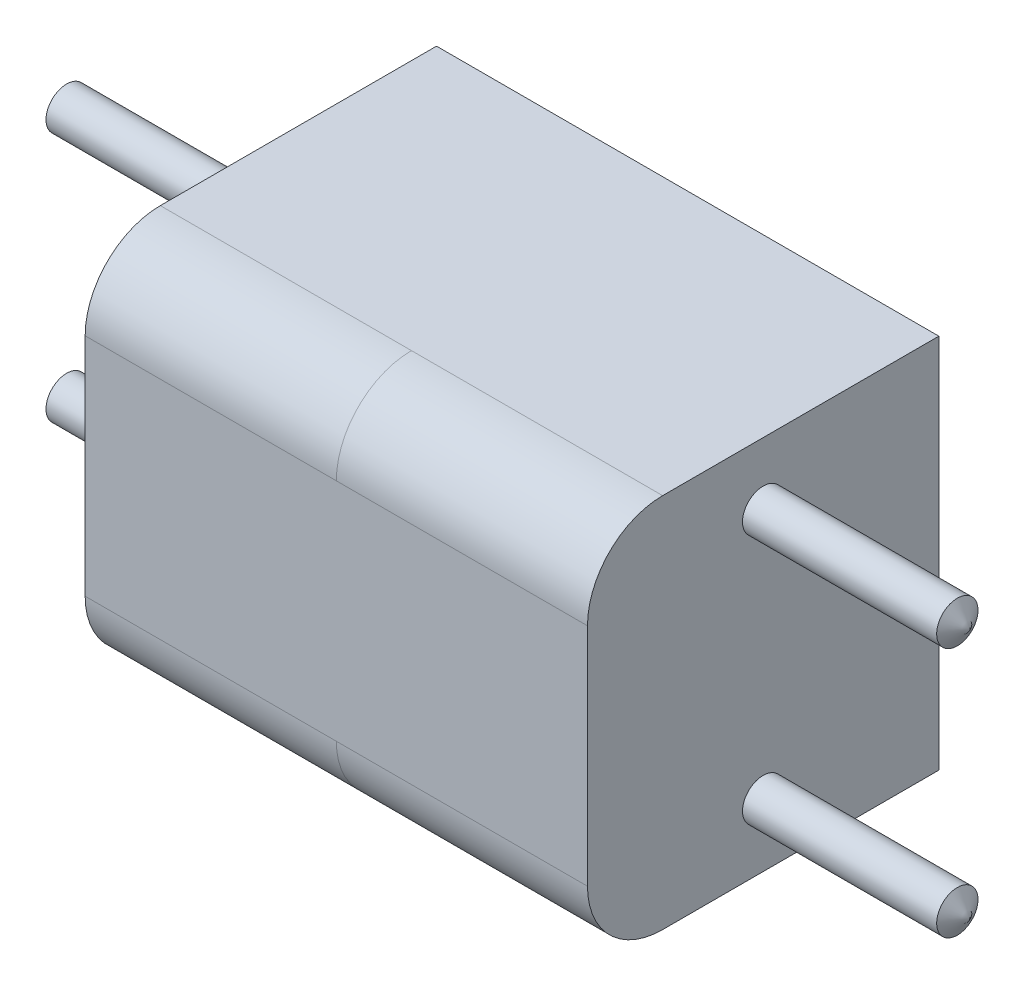
ISO-10303-21;
HEADER;
FILE_DESCRIPTION(('STEP AP214'),'2;1');
FILE_NAME('part.step','',(''),(''),'','','');
FILE_SCHEMA(('AUTOMOTIVE_DESIGN { 1 0 10303 214 1 1 1 1 }'));
ENDSEC;
DATA;
#1=APPLICATION_CONTEXT('core data for automotive mechanical design processes');
#2=APPLICATION_PROTOCOL_DEFINITION('international standard','automotive_design',2000,#1);
#3=PRODUCT_CONTEXT('',#1,'mechanical');
#4=PRODUCT('Part','Part','',(#3));
#5=PRODUCT_RELATED_PRODUCT_CATEGORY('part','',(#4));
#6=PRODUCT_DEFINITION_FORMATION('','',#4);
#7=PRODUCT_DEFINITION_CONTEXT('part definition',#1,'design');
#8=PRODUCT_DEFINITION('design','',#6,#7);
#9=PRODUCT_DEFINITION_SHAPE('','',#8);
#10=(LENGTH_UNIT() NAMED_UNIT(*) SI_UNIT(.MILLI.,.METRE.));
#11=(NAMED_UNIT(*) PLANE_ANGLE_UNIT() SI_UNIT($,.RADIAN.));
#12=(NAMED_UNIT(*) SI_UNIT($,.STERADIAN.) SOLID_ANGLE_UNIT());
#13=UNCERTAINTY_MEASURE_WITH_UNIT(LENGTH_MEASURE(1.E-05),#10,'distance_accuracy_value','');
#14=(GEOMETRIC_REPRESENTATION_CONTEXT(3) GLOBAL_UNCERTAINTY_ASSIGNED_CONTEXT((#13)) GLOBAL_UNIT_ASSIGNED_CONTEXT((#10,
#11,#12)) REPRESENTATION_CONTEXT('',''));
#15=CARTESIAN_POINT('',(0.,0.,0.));
#16=DIRECTION('',(0.,0.,1.));
#17=DIRECTION('',(1.,0.,0.));
#18=AXIS2_PLACEMENT_3D('',#15,#16,#17);
#19=CARTESIAN_POINT('',(20.05,15.00225,0.));
#20=DIRECTION('',(0.,0.,1.));
#21=DIRECTION('',(1.,0.,0.));
#22=AXIS2_PLACEMENT_3D('',#19,#20,#21);
#23=PLANE('',#22);
#24=DIRECTION('',(-1.,0.,0.));
#25=VECTOR('',#24,1.);
#26=CARTESIAN_POINT('',(20.05,-15.00225,0.));
#27=LINE('',#26,#25);
#28=CARTESIAN_POINT('',(20.05,-15.00225,0.));
#29=VERTEX_POINT('',#28);
#30=CARTESIAN_POINT('',(-20.05,-15.00225,0.));
#31=VERTEX_POINT('',#30);
#32=EDGE_CURVE('E196',#29,#31,#27,.T.);
#33=ORIENTED_EDGE('',*,*,#32,.T.);
#34=DIRECTION('',(0.,1.,0.));
#35=VECTOR('',#34,1.);
#36=CARTESIAN_POINT('',(-20.05,15.00225,0.));
#37=LINE('',#36,#35);
#38=CARTESIAN_POINT('',(-20.05,15.00225,0.));
#39=VERTEX_POINT('',#38);
#40=EDGE_CURVE('E221',#31,#39,#37,.T.);
#41=ORIENTED_EDGE('',*,*,#40,.T.);
#42=DIRECTION('',(-1.,0.,0.));
#43=VECTOR('',#42,1.);
#44=CARTESIAN_POINT('',(20.05,15.00225,0.));
#45=LINE('',#44,#43);
#46=CARTESIAN_POINT('',(20.05,15.00225,0.));
#47=VERTEX_POINT('',#46);
#48=EDGE_CURVE('E194',#47,#39,#45,.T.);
#49=ORIENTED_EDGE('',*,*,#48,.F.);
#50=DIRECTION('',(0.,1.,0.));
#51=VECTOR('',#50,1.);
#52=CARTESIAN_POINT('',(20.05,15.00225,0.));
#53=LINE('',#52,#51);
#54=EDGE_CURVE('E206',#29,#47,#53,.T.);
#55=ORIENTED_EDGE('',*,*,#54,.F.);
#56=EDGE_LOOP('',(#33,#41,#49,#55));
#57=FACE_BOUND('',#56,.T.);
#58=ADVANCED_FACE('F35',(#57),#23,.F.);
#59=CARTESIAN_POINT('',(20.05,15.00225,0.));
#60=DIRECTION('',(0.,-1.,0.));
#61=DIRECTION('',(0.,0.,-1.));
#62=AXIS2_PLACEMENT_3D('',#59,#60,#61);
#63=PLANE('',#62);
#64=DIRECTION('',(0.,0.,1.));
#65=VECTOR('',#64,1.);
#66=CARTESIAN_POINT('',(-20.05,15.00225,0.));
#67=LINE('',#66,#65);
#68=CARTESIAN_POINT('',(-20.05,15.00225,22.05));
#69=VERTEX_POINT('',#68);
#70=EDGE_CURVE('E215',#39,#69,#67,.T.);
#71=ORIENTED_EDGE('',*,*,#70,.T.);
#72=DIRECTION('',(1.,0.,0.));
#73=VECTOR('',#72,1.);
#74=CARTESIAN_POINT('',(20.05,15.00225,22.05));
#75=LINE('',#74,#73);
#76=CARTESIAN_POINT('',(0.,15.00225,22.05));
#77=VERTEX_POINT('',#76);
#78=EDGE_CURVE('E11',#69,#77,#75,.T.);
#79=ORIENTED_EDGE('',*,*,#78,.T.);
#80=DIRECTION('',(-1.,0.,0.));
#81=VECTOR('',#80,1.);
#82=CARTESIAN_POINT('',(20.05,15.00225,22.05));
#83=LINE('',#82,#81);
#84=CARTESIAN_POINT('',(20.05,15.00225,22.05));
#85=VERTEX_POINT('',#84);
#86=EDGE_CURVE('E177',#77,#85,#83,.F.);
#87=ORIENTED_EDGE('',*,*,#86,.T.);
#88=DIRECTION('',(0.,0.,1.));
#89=VECTOR('',#88,1.);
#90=CARTESIAN_POINT('',(20.05,15.00225,0.));
#91=LINE('',#90,#89);
#92=EDGE_CURVE('E203',#47,#85,#91,.T.);
#93=ORIENTED_EDGE('',*,*,#92,.F.);
#94=ORIENTED_EDGE('',*,*,#48,.T.);
#95=EDGE_LOOP('',(#71,#79,#87,#93,#94));
#96=FACE_BOUND('',#95,.T.);
#97=ADVANCED_FACE('F126',(#96),#63,.F.);
#98=CARTESIAN_POINT('',(20.05,15.00225,28.05));
#99=DIRECTION('',(0.,0.,-1.));
#100=DIRECTION('',(-1.,0.,0.));
#101=AXIS2_PLACEMENT_3D('',#98,#99,#100);
#102=PLANE('',#101);
#103=DIRECTION('',(0.,-1.,0.));
#104=VECTOR('',#103,1.);
#105=CARTESIAN_POINT('',(-20.05,15.00225,28.05));
#106=LINE('',#105,#104);
#107=CARTESIAN_POINT('',(-20.05,9.00224999999999,28.05));
#108=VERTEX_POINT('',#107);
#109=CARTESIAN_POINT('',(-20.05,-9.00225000000001,28.05));
#110=VERTEX_POINT('',#109);
#111=EDGE_CURVE('E217',#108,#110,#106,.T.);
#112=ORIENTED_EDGE('',*,*,#111,.T.);
#113=DIRECTION('',(1.,0.,0.));
#114=VECTOR('',#113,1.);
#115=CARTESIAN_POINT('',(20.05,-9.00225000000001,28.05));
#116=LINE('',#115,#114);
#117=CARTESIAN_POINT('',(0.,-9.00225000000001,28.05));
#118=VERTEX_POINT('',#117);
#119=EDGE_CURVE('E163',#110,#118,#116,.T.);
#120=ORIENTED_EDGE('',*,*,#119,.T.);
#121=DIRECTION('',(-1.,0.,0.));
#122=VECTOR('',#121,1.);
#123=CARTESIAN_POINT('',(20.05,-9.00225000000001,28.05));
#124=LINE('',#123,#122);
#125=CARTESIAN_POINT('',(20.05,-9.00225000000001,28.05));
#126=VERTEX_POINT('',#125);
#127=EDGE_CURVE('E183',#118,#126,#124,.F.);
#128=ORIENTED_EDGE('',*,*,#127,.T.);
#129=DIRECTION('',(0.,-1.,0.));
#130=VECTOR('',#129,1.);
#131=CARTESIAN_POINT('',(20.05,15.00225,28.05));
#132=LINE('',#131,#130);
#133=CARTESIAN_POINT('',(20.05,9.00224999999999,28.05));
#134=VERTEX_POINT('',#133);
#135=EDGE_CURVE('E200',#134,#126,#132,.T.);
#136=ORIENTED_EDGE('',*,*,#135,.F.);
#137=DIRECTION('',(-1.,0.,0.));
#138=VECTOR('',#137,1.);
#139=CARTESIAN_POINT('',(20.05,9.00224999999999,28.05));
#140=LINE('',#139,#138);
#141=CARTESIAN_POINT('',(0.,9.00224999999999,28.05));
#142=VERTEX_POINT('',#141);
#143=EDGE_CURVE('E185',#134,#142,#140,.T.);
#144=ORIENTED_EDGE('',*,*,#143,.T.);
#145=DIRECTION('',(1.,0.,0.));
#146=VECTOR('',#145,1.);
#147=CARTESIAN_POINT('',(20.05,9.00224999999999,28.05));
#148=LINE('',#147,#146);
#149=EDGE_CURVE('E169',#142,#108,#148,.F.);
#150=ORIENTED_EDGE('',*,*,#149,.T.);
#151=EDGE_LOOP('',(#112,#120,#128,#136,#144,#150));
#152=FACE_BOUND('',#151,.T.);
#153=ADVANCED_FACE('F132',(#152),#102,.F.);
#154=CARTESIAN_POINT('',(20.05,-15.00225,0.));
#155=DIRECTION('',(0.,1.,0.));
#156=DIRECTION('',(0.,0.,1.));
#157=AXIS2_PLACEMENT_3D('',#154,#155,#156);
#158=PLANE('',#157);
#159=DIRECTION('',(-1.,0.,0.));
#160=VECTOR('',#159,1.);
#161=CARTESIAN_POINT('',(20.05,-15.00225,22.05));
#162=LINE('',#161,#160);
#163=CARTESIAN_POINT('',(20.05,-15.00225,22.05));
#164=VERTEX_POINT('',#163);
#165=CARTESIAN_POINT('',(0.,-15.00225,22.05));
#166=VERTEX_POINT('',#165);
#167=EDGE_CURVE('E192',#164,#166,#162,.T.);
#168=ORIENTED_EDGE('',*,*,#167,.T.);
#169=DIRECTION('',(1.,0.,0.));
#170=VECTOR('',#169,1.);
#171=CARTESIAN_POINT('',(20.05,-15.00225,22.05));
#172=LINE('',#171,#170);
#173=CARTESIAN_POINT('',(-20.05,-15.00225,22.05));
#174=VERTEX_POINT('',#173);
#175=EDGE_CURVE('E58',#166,#174,#172,.F.);
#176=ORIENTED_EDGE('',*,*,#175,.T.);
#177=DIRECTION('',(0.,0.,-1.));
#178=VECTOR('',#177,1.);
#179=CARTESIAN_POINT('',(-20.05,-15.00225,0.));
#180=LINE('',#179,#178);
#181=EDGE_CURVE('E219',#174,#31,#180,.T.);
#182=ORIENTED_EDGE('',*,*,#181,.T.);
#183=ORIENTED_EDGE('',*,*,#32,.F.);
#184=DIRECTION('',(0.,0.,-1.));
#185=VECTOR('',#184,1.);
#186=CARTESIAN_POINT('',(20.05,-15.00225,0.));
#187=LINE('',#186,#185);
#188=EDGE_CURVE('E198',#164,#29,#187,.T.);
#189=ORIENTED_EDGE('',*,*,#188,.F.);
#190=EDGE_LOOP('',(#168,#176,#182,#183,#189));
#191=FACE_BOUND('',#190,.T.);
#192=ADVANCED_FACE('F244',(#191),#158,.F.);
#193=CARTESIAN_POINT('',(20.05,0.,0.));
#194=DIRECTION('',(-1.,0.,0.));
#195=DIRECTION('',(0.,0.,1.));
#196=AXIS2_PLACEMENT_3D('',#193,#194,#195);
#197=PLANE('',#196);
#198=CARTESIAN_POINT('',(20.05,-10.,14.025));
#199=DIRECTION('',(-1.,0.,0.));
#200=DIRECTION('',(0.,0.,1.));
#201=AXIS2_PLACEMENT_3D('',#198,#199,#200);
#202=CIRCLE('',#201,1.65);
#203=CARTESIAN_POINT('',(20.05,-10.,15.675));
#204=VERTEX_POINT('',#203);
#205=EDGE_CURVE('E171',#204,#204,#202,.F.);
#206=ORIENTED_EDGE('',*,*,#205,.F.);
#207=EDGE_LOOP('',(#206));
#208=FACE_BOUND('',#207,.T.);
#209=CARTESIAN_POINT('',(20.05,9.99999999999999,14.025));
#210=DIRECTION('',(-1.,0.,0.));
#211=DIRECTION('',(0.,0.,1.));
#212=AXIS2_PLACEMENT_3D('',#209,#210,#211);
#213=CIRCLE('',#212,1.65);
#214=CARTESIAN_POINT('',(20.05,9.99999999999999,15.675));
#215=VERTEX_POINT('',#214);
#216=EDGE_CURVE('E174',#215,#215,#213,.F.);
#217=ORIENTED_EDGE('',*,*,#216,.F.);
#218=EDGE_LOOP('',(#217));
#219=FACE_BOUND('',#218,.T.);
#220=ORIENTED_EDGE('',*,*,#135,.T.);
#221=CARTESIAN_POINT('',(20.05,-9.00225000000001,22.05));
#222=DIRECTION('',(-1.,0.,0.));
#223=DIRECTION('',(0.,0.,1.));
#224=AXIS2_PLACEMENT_3D('',#221,#222,#223);
#225=CIRCLE('',#224,6.);
#226=EDGE_CURVE('E179',#126,#164,#225,.F.);
#227=ORIENTED_EDGE('',*,*,#226,.T.);
#228=ORIENTED_EDGE('',*,*,#188,.T.);
#229=ORIENTED_EDGE('',*,*,#54,.T.);
#230=ORIENTED_EDGE('',*,*,#92,.T.);
#231=CARTESIAN_POINT('',(20.05,9.00224999999999,22.05));
#232=DIRECTION('',(-1.,0.,0.));
#233=DIRECTION('',(0.,0.,1.));
#234=AXIS2_PLACEMENT_3D('',#231,#232,#233);
#235=CIRCLE('',#234,6.);
#236=EDGE_CURVE('E181',#85,#134,#235,.F.);
#237=ORIENTED_EDGE('',*,*,#236,.T.);
#238=EDGE_LOOP('',(#220,#227,#228,#229,#230,#237));
#239=FACE_BOUND('',#238,.T.);
#240=ADVANCED_FACE('F142',(#208,#219,#239),#197,.F.);
#241=CARTESIAN_POINT('',(20.05,-9.00225000000001,22.05));
#242=DIRECTION('',(-1.,0.,0.));
#243=DIRECTION('',(0.,0.,1.));
#244=AXIS2_PLACEMENT_3D('',#241,#242,#243);
#245=CYLINDRICAL_SURFACE('',#244,6.);
#246=ORIENTED_EDGE('',*,*,#226,.F.);
#247=ORIENTED_EDGE('',*,*,#127,.F.);
#248=CARTESIAN_POINT('',(0.,-9.00225000000001,22.05));
#249=DIRECTION('',(-1.,0.,0.));
#250=DIRECTION('',(0.,0.,1.));
#251=AXIS2_PLACEMENT_3D('',#248,#249,#250);
#252=CIRCLE('',#251,6.);
#253=EDGE_CURVE('E188',#166,#118,#252,.T.);
#254=ORIENTED_EDGE('',*,*,#253,.F.);
#255=ORIENTED_EDGE('',*,*,#167,.F.);
#256=EDGE_LOOP('',(#246,#247,#254,#255));
#257=FACE_BOUND('',#256,.T.);
#258=ADVANCED_FACE('F138',(#257),#245,.T.);
#259=CARTESIAN_POINT('',(20.05,9.00224999999999,22.05));
#260=DIRECTION('',(-1.,0.,0.));
#261=DIRECTION('',(0.,0.,1.));
#262=AXIS2_PLACEMENT_3D('',#259,#260,#261);
#263=CYLINDRICAL_SURFACE('',#262,6.);
#264=ORIENTED_EDGE('',*,*,#236,.F.);
#265=ORIENTED_EDGE('',*,*,#86,.F.);
#266=CARTESIAN_POINT('',(0.,9.00224999999999,22.05));
#267=DIRECTION('',(-1.,0.,0.));
#268=DIRECTION('',(0.,0.,1.));
#269=AXIS2_PLACEMENT_3D('',#266,#267,#268);
#270=CIRCLE('',#269,6.);
#271=EDGE_CURVE('E190',#142,#77,#270,.T.);
#272=ORIENTED_EDGE('',*,*,#271,.F.);
#273=ORIENTED_EDGE('',*,*,#143,.F.);
#274=EDGE_LOOP('',(#264,#265,#272,#273));
#275=FACE_BOUND('',#274,.T.);
#276=ADVANCED_FACE('F141',(#275),#263,.T.);
#277=CARTESIAN_POINT('',(35.55,9.99999999999999,14.025));
#278=DIRECTION('',(-1.,0.,0.));
#279=DIRECTION('',(0.,0.,1.));
#280=AXIS2_PLACEMENT_3D('',#277,#278,#279);
#281=CYLINDRICAL_SURFACE('',#280,1.65);
#282=CARTESIAN_POINT('',(35.55,9.99999999999999,14.025));
#283=DIRECTION('',(1.,0.,0.));
#284=DIRECTION('',(0.,0.,-1.));
#285=AXIS2_PLACEMENT_3D('',#282,#283,#284);
#286=CIRCLE('',#285,1.65);
#287=CARTESIAN_POINT('',(35.55,9.99999999999999,12.375));
#288=VERTEX_POINT('',#287);
#289=EDGE_CURVE('E209',#288,#288,#286,.T.);
#290=ORIENTED_EDGE('',*,*,#289,.F.);
#291=EDGE_LOOP('',(#290));
#292=FACE_BOUND('',#291,.T.);
#293=ORIENTED_EDGE('',*,*,#216,.T.);
#294=EDGE_LOOP('',(#293));
#295=FACE_BOUND('',#294,.T.);
#296=ADVANCED_FACE('F145',(#292,#295),#281,.T.);
#297=CARTESIAN_POINT('',(35.55,-10.,14.025));
#298=DIRECTION('',(-1.,0.,0.));
#299=DIRECTION('',(0.,0.,1.));
#300=AXIS2_PLACEMENT_3D('',#297,#298,#299);
#301=CYLINDRICAL_SURFACE('',#300,1.65);
#302=CARTESIAN_POINT('',(35.55,-10.,14.025));
#303=DIRECTION('',(1.,0.,0.));
#304=DIRECTION('',(0.,0.,-1.));
#305=AXIS2_PLACEMENT_3D('',#302,#303,#304);
#306=CIRCLE('',#305,1.65);
#307=CARTESIAN_POINT('',(35.55,-10.,12.375));
#308=VERTEX_POINT('',#307);
#309=EDGE_CURVE('E212',#308,#308,#306,.T.);
#310=ORIENTED_EDGE('',*,*,#309,.F.);
#311=EDGE_LOOP('',(#310));
#312=FACE_BOUND('',#311,.T.);
#313=ORIENTED_EDGE('',*,*,#205,.T.);
#314=EDGE_LOOP('',(#313));
#315=FACE_BOUND('',#314,.T.);
#316=ADVANCED_FACE('F270',(#312,#315),#301,.T.);
#317=CARTESIAN_POINT('',(36.5414200213955,9.99999999999999,14.025));
#318=DIRECTION('',(-1.,0.,0.));
#319=DIRECTION('',(0.,0.,1.));
#320=AXIS2_PLACEMENT_3D('',#317,#318,#319);
#321=CONICAL_SURFACE('',#320,0.,1.02974425867666);
#322=ORIENTED_EDGE('',*,*,#289,.T.);
#323=EDGE_LOOP('',(#322));
#324=FACE_BOUND('',#323,.T.);
#325=CARTESIAN_POINT('',(36.5414200213955,9.99999999999999,14.025));
#326=VERTEX_POINT('',#325);
#327=VERTEX_LOOP('',#326);
#328=FACE_BOUND('',#327,.T.);
#329=ADVANCED_FACE('F274',(#324,#328),#321,.T.);
#330=CARTESIAN_POINT('',(36.5414200213955,-10.,14.025));
#331=DIRECTION('',(-1.,0.,0.));
#332=DIRECTION('',(0.,0.,1.));
#333=AXIS2_PLACEMENT_3D('',#330,#331,#332);
#334=CONICAL_SURFACE('',#333,0.,1.02974425867666);
#335=ORIENTED_EDGE('',*,*,#309,.T.);
#336=EDGE_LOOP('',(#335));
#337=FACE_BOUND('',#336,.T.);
#338=CARTESIAN_POINT('',(36.5414200213955,-10.,14.025));
#339=VERTEX_POINT('',#338);
#340=VERTEX_LOOP('',#339);
#341=FACE_BOUND('',#340,.T.);
#342=ADVANCED_FACE('F157',(#337,#341),#334,.T.);
#343=CARTESIAN_POINT('',(-20.05,0.,0.));
#344=DIRECTION('',(1.,0.,0.));
#345=DIRECTION('',(0.,0.,1.));
#346=AXIS2_PLACEMENT_3D('',#343,#344,#345);
#347=PLANE('',#346);
#348=CARTESIAN_POINT('',(-20.05,-10.,14.025));
#349=DIRECTION('',(1.,0.,0.));
#350=DIRECTION('',(0.,0.,-1.));
#351=AXIS2_PLACEMENT_3D('',#348,#349,#350);
#352=CIRCLE('',#351,1.65);
#353=CARTESIAN_POINT('',(-20.05,-10.,12.375));
#354=VERTEX_POINT('',#353);
#355=EDGE_CURVE('E227',#354,#354,#352,.T.);
#356=ORIENTED_EDGE('',*,*,#355,.T.);
#357=EDGE_LOOP('',(#356));
#358=FACE_BOUND('',#357,.T.);
#359=CARTESIAN_POINT('',(-20.05,9.99999999999999,14.025));
#360=DIRECTION('',(1.,0.,0.));
#361=DIRECTION('',(0.,0.,-1.));
#362=AXIS2_PLACEMENT_3D('',#359,#360,#361);
#363=CIRCLE('',#362,1.65);
#364=CARTESIAN_POINT('',(-20.05,9.99999999999999,12.375));
#365=VERTEX_POINT('',#364);
#366=EDGE_CURVE('E224',#365,#365,#363,.T.);
#367=ORIENTED_EDGE('',*,*,#366,.T.);
#368=EDGE_LOOP('',(#367));
#369=FACE_BOUND('',#368,.T.);
#370=ORIENTED_EDGE('',*,*,#181,.F.);
#371=CARTESIAN_POINT('',(-20.05,-9.00225000000001,22.05));
#372=DIRECTION('',(1.,0.,0.));
#373=DIRECTION('',(0.,0.,-1.));
#374=AXIS2_PLACEMENT_3D('',#371,#372,#373);
#375=CIRCLE('',#374,6.);
#376=EDGE_CURVE('E43',#174,#110,#375,.F.);
#377=ORIENTED_EDGE('',*,*,#376,.T.);
#378=ORIENTED_EDGE('',*,*,#111,.F.);
#379=CARTESIAN_POINT('',(-20.05,9.00224999999999,22.05));
#380=DIRECTION('',(1.,0.,0.));
#381=DIRECTION('',(0.,0.,-1.));
#382=AXIS2_PLACEMENT_3D('',#379,#380,#381);
#383=CIRCLE('',#382,6.);
#384=EDGE_CURVE('E50',#108,#69,#383,.F.);
#385=ORIENTED_EDGE('',*,*,#384,.T.);
#386=ORIENTED_EDGE('',*,*,#70,.F.);
#387=ORIENTED_EDGE('',*,*,#40,.F.);
#388=EDGE_LOOP('',(#370,#377,#378,#385,#386,#387));
#389=FACE_BOUND('',#388,.T.);
#390=ADVANCED_FACE('F149',(#358,#369,#389),#347,.F.);
#391=CARTESIAN_POINT('',(20.05,-9.00225000000001,22.05));
#392=DIRECTION('',(1.,0.,0.));
#393=DIRECTION('',(0.,0.,-1.));
#394=AXIS2_PLACEMENT_3D('',#391,#392,#393);
#395=CYLINDRICAL_SURFACE('',#394,6.);
#396=ORIENTED_EDGE('',*,*,#376,.F.);
#397=ORIENTED_EDGE('',*,*,#175,.F.);
#398=ORIENTED_EDGE('',*,*,#253,.T.);
#399=ORIENTED_EDGE('',*,*,#119,.F.);
#400=EDGE_LOOP('',(#396,#397,#398,#399));
#401=FACE_BOUND('',#400,.T.);
#402=ADVANCED_FACE('F147',(#401),#395,.T.);
#403=CARTESIAN_POINT('',(20.05,9.00224999999999,22.05));
#404=DIRECTION('',(1.,0.,0.));
#405=DIRECTION('',(0.,0.,-1.));
#406=AXIS2_PLACEMENT_3D('',#403,#404,#405);
#407=CYLINDRICAL_SURFACE('',#406,6.);
#408=ORIENTED_EDGE('',*,*,#384,.F.);
#409=ORIENTED_EDGE('',*,*,#149,.F.);
#410=ORIENTED_EDGE('',*,*,#271,.T.);
#411=ORIENTED_EDGE('',*,*,#78,.F.);
#412=EDGE_LOOP('',(#408,#409,#410,#411));
#413=FACE_BOUND('',#412,.T.);
#414=ADVANCED_FACE('F37',(#413),#407,.T.);
#415=CARTESIAN_POINT('',(-35.55,9.99999999999999,14.025));
#416=DIRECTION('',(1.,0.,0.));
#417=DIRECTION('',(0.,0.,-1.));
#418=AXIS2_PLACEMENT_3D('',#415,#416,#417);
#419=CYLINDRICAL_SURFACE('',#418,1.65);
#420=CARTESIAN_POINT('',(-35.55,9.99999999999999,14.025));
#421=DIRECTION('',(1.,0.,0.));
#422=DIRECTION('',(0.,0.,-1.));
#423=AXIS2_PLACEMENT_3D('',#420,#421,#422);
#424=CIRCLE('',#423,1.65);
#425=CARTESIAN_POINT('',(-35.55,9.99999999999999,12.375));
#426=VERTEX_POINT('',#425);
#427=EDGE_CURVE('E230',#426,#426,#424,.T.);
#428=ORIENTED_EDGE('',*,*,#427,.T.);
#429=EDGE_LOOP('',(#428));
#430=FACE_BOUND('',#429,.T.);
#431=ORIENTED_EDGE('',*,*,#366,.F.);
#432=EDGE_LOOP('',(#431));
#433=FACE_BOUND('',#432,.T.);
#434=ADVANCED_FACE('F155',(#430,#433),#419,.T.);
#435=CARTESIAN_POINT('',(-35.55,-10.,14.025));
#436=DIRECTION('',(1.,0.,0.));
#437=DIRECTION('',(0.,0.,-1.));
#438=AXIS2_PLACEMENT_3D('',#435,#436,#437);
#439=CYLINDRICAL_SURFACE('',#438,1.65);
#440=CARTESIAN_POINT('',(-35.55,-10.,14.025));
#441=DIRECTION('',(1.,0.,0.));
#442=DIRECTION('',(0.,0.,-1.));
#443=AXIS2_PLACEMENT_3D('',#440,#441,#442);
#444=CIRCLE('',#443,1.65);
#445=CARTESIAN_POINT('',(-35.55,-10.,12.375));
#446=VERTEX_POINT('',#445);
#447=EDGE_CURVE('E233',#446,#446,#444,.T.);
#448=ORIENTED_EDGE('',*,*,#447,.T.);
#449=EDGE_LOOP('',(#448));
#450=FACE_BOUND('',#449,.T.);
#451=ORIENTED_EDGE('',*,*,#355,.F.);
#452=EDGE_LOOP('',(#451));
#453=FACE_BOUND('',#452,.T.);
#454=ADVANCED_FACE('F121',(#450,#453),#439,.T.);
#455=CARTESIAN_POINT('',(-36.5414200213955,9.99999999999999,14.025));
#456=DIRECTION('',(1.,0.,0.));
#457=DIRECTION('',(0.,0.,1.));
#458=AXIS2_PLACEMENT_3D('',#455,#456,#457);
#459=CONICAL_SURFACE('',#458,0.,1.02974425867666);
#460=ORIENTED_EDGE('',*,*,#427,.F.);
#461=EDGE_LOOP('',(#460));
#462=FACE_BOUND('',#461,.T.);
#463=CARTESIAN_POINT('',(-36.5414200213955,9.99999999999999,14.025));
#464=VERTEX_POINT('',#463);
#465=VERTEX_LOOP('',#464);
#466=FACE_BOUND('',#465,.T.);
#467=ADVANCED_FACE('F115',(#462,#466),#459,.T.);
#468=CARTESIAN_POINT('',(-36.5414200213955,-10.,14.025));
#469=DIRECTION('',(1.,0.,0.));
#470=DIRECTION('',(0.,0.,1.));
#471=AXIS2_PLACEMENT_3D('',#468,#469,#470);
#472=CONICAL_SURFACE('',#471,0.,1.02974425867666);
#473=ORIENTED_EDGE('',*,*,#447,.F.);
#474=EDGE_LOOP('',(#473));
#475=FACE_BOUND('',#474,.T.);
#476=CARTESIAN_POINT('',(-36.5414200213955,-10.,14.025));
#477=VERTEX_POINT('',#476);
#478=VERTEX_LOOP('',#477);
#479=FACE_BOUND('',#478,.T.);
#480=ADVANCED_FACE('F113',(#475,#479),#472,.T.);
#481=CLOSED_SHELL('',(#58,#97,#153,#192,#240,#258,#276,#296,#316,#329,#342,#390,#402,#414,#434,
#454,#467,#480));
#482=MANIFOLD_SOLID_BREP('B2',#481);
#483=ADVANCED_BREP_SHAPE_REPRESENTATION('',(#18,#482),#14);
#484=SHAPE_DEFINITION_REPRESENTATION(#9,#483);
ENDSEC;
END-ISO-10303-21;
